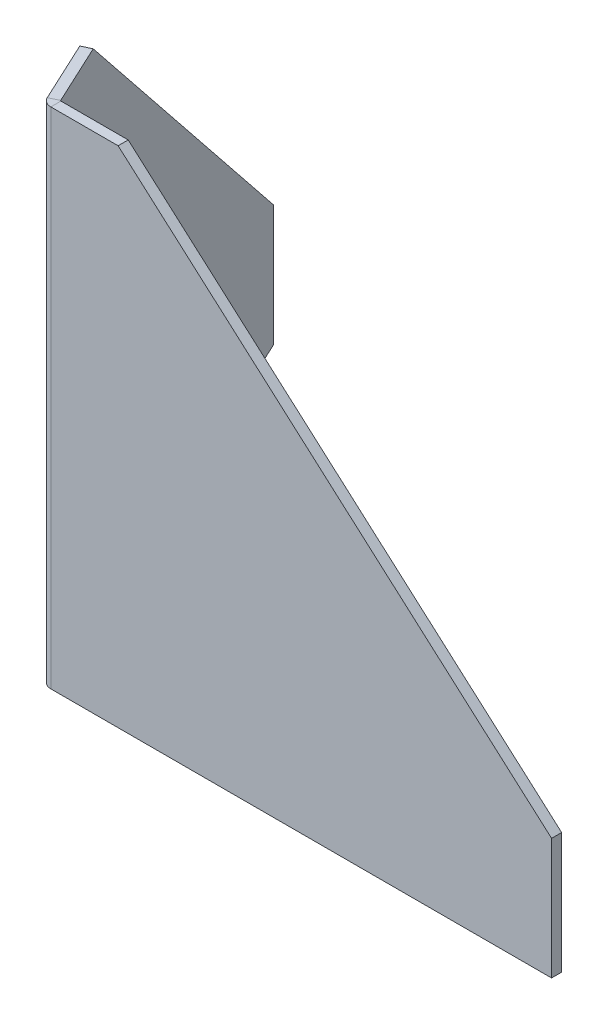
ISO-10303-21;
HEADER;
FILE_DESCRIPTION(('STEP AP214'),'2;1');
FILE_NAME('part.step','',(''),(''),'','','');
FILE_SCHEMA(('AUTOMOTIVE_DESIGN { 1 0 10303 214 1 1 1 1 }'));
ENDSEC;
DATA;
#1=APPLICATION_CONTEXT('core data for automotive mechanical design processes');
#2=APPLICATION_PROTOCOL_DEFINITION('international standard','automotive_design',2000,#1);
#3=PRODUCT_CONTEXT('',#1,'mechanical');
#4=PRODUCT('Part','Part','',(#3));
#5=PRODUCT_RELATED_PRODUCT_CATEGORY('part','',(#4));
#6=PRODUCT_DEFINITION_FORMATION('','',#4);
#7=PRODUCT_DEFINITION_CONTEXT('part definition',#1,'design');
#8=PRODUCT_DEFINITION('design','',#6,#7);
#9=PRODUCT_DEFINITION_SHAPE('','',#8);
#10=(LENGTH_UNIT() NAMED_UNIT(*) SI_UNIT(.MILLI.,.METRE.));
#11=(NAMED_UNIT(*) PLANE_ANGLE_UNIT() SI_UNIT($,.RADIAN.));
#12=(NAMED_UNIT(*) SI_UNIT($,.STERADIAN.) SOLID_ANGLE_UNIT());
#13=UNCERTAINTY_MEASURE_WITH_UNIT(LENGTH_MEASURE(1.E-05),#10,'distance_accuracy_value','');
#14=(GEOMETRIC_REPRESENTATION_CONTEXT(3) GLOBAL_UNCERTAINTY_ASSIGNED_CONTEXT((#13)) GLOBAL_UNIT_ASSIGNED_CONTEXT((#10,
#11,#12)) REPRESENTATION_CONTEXT('',''));
#15=CARTESIAN_POINT('',(0.,0.,0.));
#16=DIRECTION('',(0.,0.,1.));
#17=DIRECTION('',(1.,0.,0.));
#18=AXIS2_PLACEMENT_3D('',#15,#16,#17);
#19=CARTESIAN_POINT('',(-143481.126517868,128567.414220515,-7.47618913808878));
#20=DIRECTION('',(0.,1.,0.));
#21=DIRECTION('',(-0.906307787036651,0.,0.422618261740697));
#22=AXIS2_PLACEMENT_3D('',#19,#20,#21);
#23=PLANE('',#22);
#24=DIRECTION('',(-0.422618261740697,0.,-0.906307787036651));
#25=VECTOR('',#24,1.);
#26=CARTESIAN_POINT('',(-143490.189595738,128567.414220515,-3.25000652068752));
#27=LINE('',#26,#25);
#28=CARTESIAN_POINT('',(-143491.564788433,128567.414220515,-6.19911677096445));
#29=VERTEX_POINT('',#28);
#30=CARTESIAN_POINT('',(-143519.77287406,128567.414220515,-66.6915516132462));
#31=VERTEX_POINT('',#30);
#32=EDGE_CURVE('E150',#29,#31,#27,.T.);
#33=ORIENTED_EDGE('',*,*,#32,.F.);
#34=DIRECTION('',(0.906307787036651,0.,-0.422618261740697));
#35=VECTOR('',#34,1.);
#36=CARTESIAN_POINT('',(-143482.501710563,128567.414220515,-10.4252993884018));
#37=LINE('',#36,#35);
#38=CARTESIAN_POINT('',(-143482.501710563,128567.414220515,-10.4252993884011));
#39=VERTEX_POINT('',#38);
#40=EDGE_CURVE('E134',#29,#39,#37,.T.);
#41=ORIENTED_EDGE('',*,*,#40,.T.);
#42=DIRECTION('',(-0.422618261740697,0.,-0.906307787036651));
#43=VECTOR('',#42,1.);
#44=CARTESIAN_POINT('',(-143481.126517868,128567.414220515,-7.47618913808878));
#45=LINE('',#44,#43);
#46=CARTESIAN_POINT('',(-143510.70979619,128567.414220515,-70.9177342306475));
#47=VERTEX_POINT('',#46);
#48=EDGE_CURVE('E45',#39,#47,#45,.T.);
#49=ORIENTED_EDGE('',*,*,#48,.T.);
#50=DIRECTION('',(-0.906307787036651,0.,0.422618261740697));
#51=VECTOR('',#50,1.);
#52=CARTESIAN_POINT('',(-143510.70979619,128567.414220515,-70.9177342306475));
#53=LINE('',#52,#51);
#54=EDGE_CURVE('E159',#47,#31,#53,.T.);
#55=ORIENTED_EDGE('',*,*,#54,.T.);
#56=EDGE_LOOP('',(#33,#41,#49,#55));
#57=FACE_BOUND('',#56,.T.);
#58=ADVANCED_FACE('F41',(#57),#23,.T.);
#59=CARTESIAN_POINT('',(-143667.078553034,128067.414220515,-406.251615434201));
#60=DIRECTION('',(0.,-1.,0.));
#61=DIRECTION('',(0.906307787036651,0.,-0.422618261740697));
#62=AXIS2_PLACEMENT_3D('',#59,#60,#61);
#63=PLANE('',#62);
#64=DIRECTION('',(0.422618261740697,0.,0.906307787036651));
#65=VECTOR('',#64,1.);
#66=CARTESIAN_POINT('',(-143667.078553034,128067.414220515,-406.251615434201));
#67=LINE('',#66,#65);
#68=CARTESIAN_POINT('',(-143667.078553034,128067.414220515,-406.251615434201));
#69=VERTEX_POINT('',#68);
#70=CARTESIAN_POINT('',(-143482.501710563,128067.414220515,-10.4252993884018));
#71=VERTEX_POINT('',#70);
#72=EDGE_CURVE('E157',#69,#71,#67,.T.);
#73=ORIENTED_EDGE('',*,*,#72,.T.);
#74=DIRECTION('',(-0.906307787036651,0.,0.422618261740697));
#75=VECTOR('',#74,1.);
#76=CARTESIAN_POINT('',(-143482.501710563,128067.414220515,-10.4252993884018));
#77=LINE('',#76,#75);
#78=CARTESIAN_POINT('',(-143491.564788433,128067.414220515,-6.19911677096445));
#79=VERTEX_POINT('',#78);
#80=EDGE_CURVE('E12',#71,#79,#77,.T.);
#81=ORIENTED_EDGE('',*,*,#80,.T.);
#82=DIRECTION('',(0.422618261740697,0.,0.906307787036651));
#83=VECTOR('',#82,1.);
#84=CARTESIAN_POINT('',(-143676.141630904,128067.414220515,-402.025432816799));
#85=LINE('',#84,#83);
#86=CARTESIAN_POINT('',(-143676.141630904,128067.414220515,-402.025432816799));
#87=VERTEX_POINT('',#86);
#88=EDGE_CURVE('E161',#87,#79,#85,.T.);
#89=ORIENTED_EDGE('',*,*,#88,.F.);
#90=DIRECTION('',(-0.906307787036651,0.,0.422618261740697));
#91=VECTOR('',#90,1.);
#92=CARTESIAN_POINT('',(-143667.078553034,128067.414220515,-406.251615434201));
#93=LINE('',#92,#91);
#94=EDGE_CURVE('E67',#69,#87,#93,.T.);
#95=ORIENTED_EDGE('',*,*,#94,.F.);
#96=EDGE_LOOP('',(#73,#81,#89,#95));
#97=FACE_BOUND('',#96,.T.);
#98=ADVANCED_FACE('F43',(#97),#63,.T.);
#99=CARTESIAN_POINT('',(-82841.7079962175,0.,130034.176486218));
#100=DIRECTION('',(0.906307787036651,0.,-0.422618261740697));
#101=DIRECTION('',(-0.422618261740697,0.,-0.906307787036651));
#102=AXIS2_PLACEMENT_3D('',#99,#100,#101);
#103=PLANE('',#102);
#104=ORIENTED_EDGE('',*,*,#48,.F.);
#105=DIRECTION('',(0.,-1.,0.));
#106=VECTOR('',#105,1.);
#107=CARTESIAN_POINT('',(-143482.501710563,0.,-10.4252993884018));
#108=LINE('',#107,#106);
#109=EDGE_CURVE('E129',#39,#71,#108,.T.);
#110=ORIENTED_EDGE('',*,*,#109,.T.);
#111=ORIENTED_EDGE('',*,*,#72,.F.);
#112=DIRECTION('',(0.,-1.,0.));
#113=VECTOR('',#112,1.);
#114=CARTESIAN_POINT('',(-143667.078553034,128067.414220515,-406.251615434201));
#115=LINE('',#114,#113);
#116=CARTESIAN_POINT('',(-143667.078553034,128187.414220515,-406.251615434201));
#117=VERTEX_POINT('',#116);
#118=EDGE_CURVE('E160',#117,#69,#115,.T.);
#119=ORIENTED_EDGE('',*,*,#118,.F.);
#120=DIRECTION('',(-0.294825549996127,-0.716471188104806,-0.632255432309734));
#121=VECTOR('',#120,1.);
#122=CARTESIAN_POINT('',(-143667.078553034,128187.414220515,-406.251615434201));
#123=LINE('',#122,#121);
#124=EDGE_CURVE('E149',#47,#117,#123,.T.);
#125=ORIENTED_EDGE('',*,*,#124,.F.);
#126=EDGE_LOOP('',(#104,#110,#111,#119,#125));
#127=FACE_BOUND('',#126,.T.);
#128=ADVANCED_FACE('F146',(#127),#103,.T.);
#129=CARTESIAN_POINT('',(-143667.078553034,128067.414220515,-406.251615434201));
#130=DIRECTION('',(-0.422618261740697,0.,-0.906307787036651));
#131=DIRECTION('',(-0.906307787036651,0.,0.422618261740697));
#132=AXIS2_PLACEMENT_3D('',#129,#130,#131);
#133=PLANE('',#132);
#134=DIRECTION('',(0.,-1.,0.));
#135=VECTOR('',#134,1.);
#136=CARTESIAN_POINT('',(-143676.141630904,128067.414220515,-402.025432816799));
#137=LINE('',#136,#135);
#138=CARTESIAN_POINT('',(-143676.141630904,128187.414220515,-402.025432816799));
#139=VERTEX_POINT('',#138);
#140=EDGE_CURVE('E163',#139,#87,#137,.T.);
#141=ORIENTED_EDGE('',*,*,#140,.F.);
#142=DIRECTION('',(-0.906307787036651,0.,0.422618261740697));
#143=VECTOR('',#142,1.);
#144=CARTESIAN_POINT('',(-143667.078553034,128187.414220515,-406.251615434201));
#145=LINE('',#144,#143);
#146=EDGE_CURVE('E171',#117,#139,#145,.T.);
#147=ORIENTED_EDGE('',*,*,#146,.F.);
#148=ORIENTED_EDGE('',*,*,#118,.T.);
#149=ORIENTED_EDGE('',*,*,#94,.T.);
#150=EDGE_LOOP('',(#141,#147,#148,#149));
#151=FACE_BOUND('',#150,.T.);
#152=ADVANCED_FACE('F266',(#151),#133,.T.);
#153=CARTESIAN_POINT('',(-143667.078553034,128187.414220515,-406.251615434201));
#154=DIRECTION('',(-0.302793808104145,0.697616683154644,-0.649343416966787));
#155=DIRECTION('',(-0.294825549996127,-0.716471188104806,-0.632255432309734));
#156=AXIS2_PLACEMENT_3D('',#153,#154,#155);
#157=PLANE('',#156);
#158=DIRECTION('',(-0.294825549996127,-0.716471188104806,-0.632255432309734));
#159=VECTOR('',#158,1.);
#160=CARTESIAN_POINT('',(-143676.141630904,128187.414220515,-402.025432816799));
#161=LINE('',#160,#159);
#162=EDGE_CURVE('E169',#31,#139,#161,.T.);
#163=ORIENTED_EDGE('',*,*,#162,.F.);
#164=ORIENTED_EDGE('',*,*,#54,.F.);
#165=ORIENTED_EDGE('',*,*,#124,.T.);
#166=ORIENTED_EDGE('',*,*,#146,.T.);
#167=EDGE_LOOP('',(#163,#164,#165,#166));
#168=FACE_BOUND('',#167,.T.);
#169=ADVANCED_FACE('F172',(#168),#157,.T.);
#170=CARTESIAN_POINT('',(-82850.7710740878,0.,130038.402668835));
#171=DIRECTION('',(0.906307787036651,0.,-0.422618261740697));
#172=DIRECTION('',(-0.422618261740697,0.,-0.906307787036651));
#173=AXIS2_PLACEMENT_3D('',#170,#171,#172);
#174=PLANE('',#173);
#175=DIRECTION('',(0.,-1.,0.));
#176=VECTOR('',#175,1.);
#177=CARTESIAN_POINT('',(-143491.564788433,0.,-6.19911677100049));
#178=LINE('',#177,#176);
#179=EDGE_CURVE('E50',#29,#79,#178,.T.);
#180=ORIENTED_EDGE('',*,*,#179,.F.);
#181=ORIENTED_EDGE('',*,*,#32,.T.);
#182=ORIENTED_EDGE('',*,*,#162,.T.);
#183=ORIENTED_EDGE('',*,*,#140,.T.);
#184=ORIENTED_EDGE('',*,*,#88,.T.);
#185=EDGE_LOOP('',(#180,#181,#182,#183,#184));
#186=FACE_BOUND('',#185,.T.);
#187=ADVANCED_FACE('F166',(#186),#174,.F.);
#188=CARTESIAN_POINT('',(-142985.088107377,128067.414220515,-10.));
#189=DIRECTION('',(1.,0.,0.));
#190=DIRECTION('',(0.,0.,-1.));
#191=AXIS2_PLACEMENT_3D('',#188,#189,#190);
#192=PLANE('',#191);
#193=DIRECTION('',(0.,1.,0.));
#194=VECTOR('',#193,1.);
#195=CARTESIAN_POINT('',(-142985.088107377,128067.414220515,0.));
#196=LINE('',#195,#194);
#197=CARTESIAN_POINT('',(-142985.088107377,128067.414220515,0.));
#198=VERTEX_POINT('',#197);
#199=CARTESIAN_POINT('',(-142985.088107377,128187.414220515,0.));
#200=VERTEX_POINT('',#199);
#201=EDGE_CURVE('E209',#198,#200,#196,.T.);
#202=ORIENTED_EDGE('',*,*,#201,.F.);
#203=DIRECTION('',(0.,0.,1.));
#204=VECTOR('',#203,1.);
#205=CARTESIAN_POINT('',(-142985.088107377,128067.414220515,-10.));
#206=LINE('',#205,#204);
#207=CARTESIAN_POINT('',(-142985.088107377,128067.414220515,-10.));
#208=VERTEX_POINT('',#207);
#209=EDGE_CURVE('E173',#208,#198,#206,.T.);
#210=ORIENTED_EDGE('',*,*,#209,.F.);
#211=DIRECTION('',(0.,1.,0.));
#212=VECTOR('',#211,1.);
#213=CARTESIAN_POINT('',(-142985.088107377,128067.414220515,-10.));
#214=LINE('',#213,#212);
#215=CARTESIAN_POINT('',(-142985.088107377,128187.414220515,-10.));
#216=VERTEX_POINT('',#215);
#217=EDGE_CURVE('E190',#208,#216,#214,.T.);
#218=ORIENTED_EDGE('',*,*,#217,.T.);
#219=DIRECTION('',(0.,0.,1.));
#220=VECTOR('',#219,1.);
#221=CARTESIAN_POINT('',(-142985.088107377,128187.414220515,-10.));
#222=LINE('',#221,#220);
#223=EDGE_CURVE('E193',#216,#200,#222,.T.);
#224=ORIENTED_EDGE('',*,*,#223,.T.);
#225=EDGE_LOOP('',(#202,#210,#218,#224));
#226=FACE_BOUND('',#225,.T.);
#227=ADVANCED_FACE('F241',(#226),#192,.T.);
#228=CARTESIAN_POINT('',(-142985.088107377,128187.414220515,-10.));
#229=DIRECTION('',(0.662197796471728,0.749329085481131,0.));
#230=DIRECTION('',(-0.749329085481131,0.662197796471728,0.));
#231=AXIS2_PLACEMENT_3D('',#228,#229,#230);
#232=PLANE('',#231);
#233=DIRECTION('',(-0.749329085481131,0.662197796471728,0.));
#234=VECTOR('',#233,1.);
#235=CARTESIAN_POINT('',(-142985.088107377,128187.414220515,0.));
#236=LINE('',#235,#234);
#237=CARTESIAN_POINT('',(-143415.088107377,128567.414220515,0.));
#238=VERTEX_POINT('',#237);
#239=EDGE_CURVE('E212',#200,#238,#236,.T.);
#240=ORIENTED_EDGE('',*,*,#239,.F.);
#241=ORIENTED_EDGE('',*,*,#223,.F.);
#242=DIRECTION('',(-0.749329085481131,0.662197796471728,0.));
#243=VECTOR('',#242,1.);
#244=CARTESIAN_POINT('',(-142985.088107377,128187.414220515,-10.));
#245=LINE('',#244,#243);
#246=CARTESIAN_POINT('',(-143415.088107377,128567.414220515,-10.));
#247=VERTEX_POINT('',#246);
#248=EDGE_CURVE('E195',#216,#247,#245,.T.);
#249=ORIENTED_EDGE('',*,*,#248,.T.);
#250=DIRECTION('',(0.,0.,1.));
#251=VECTOR('',#250,1.);
#252=CARTESIAN_POINT('',(-143415.088107377,128567.414220515,-10.));
#253=LINE('',#252,#251);
#254=EDGE_CURVE('E198',#247,#238,#253,.T.);
#255=ORIENTED_EDGE('',*,*,#254,.T.);
#256=EDGE_LOOP('',(#240,#241,#249,#255));
#257=FACE_BOUND('',#256,.T.);
#258=ADVANCED_FACE('F246',(#257),#232,.T.);
#259=CARTESIAN_POINT('',(0.,0.,-10.));
#260=DIRECTION('',(0.,0.,-1.));
#261=DIRECTION('',(-1.,0.,0.));
#262=AXIS2_PLACEMENT_3D('',#259,#260,#261);
#263=PLANE('',#262);
#264=DIRECTION('',(0.,-1.,0.));
#265=VECTOR('',#264,1.);
#266=CARTESIAN_POINT('',(-143481.834124247,0.,-10.));
#267=LINE('',#266,#265);
#268=CARTESIAN_POINT('',(-143481.834124247,128567.414220515,-10.0000000000016));
#269=VERTEX_POINT('',#268);
#270=CARTESIAN_POINT('',(-143481.834124247,128067.414220515,-10.));
#271=VERTEX_POINT('',#270);
#272=EDGE_CURVE('E184',#269,#271,#267,.T.);
#273=ORIENTED_EDGE('',*,*,#272,.F.);
#274=DIRECTION('',(-1.,0.,0.));
#275=VECTOR('',#274,1.);
#276=CARTESIAN_POINT('',(-143485.088107377,128567.414220515,-10.));
#277=LINE('',#276,#275);
#278=EDGE_CURVE('E200',#247,#269,#277,.T.);
#279=ORIENTED_EDGE('',*,*,#278,.F.);
#280=ORIENTED_EDGE('',*,*,#248,.F.);
#281=ORIENTED_EDGE('',*,*,#217,.F.);
#282=DIRECTION('',(1.,0.,0.));
#283=VECTOR('',#282,1.);
#284=CARTESIAN_POINT('',(-143925.088107377,128067.414220515,-10.));
#285=LINE('',#284,#283);
#286=EDGE_CURVE('E177',#271,#208,#285,.T.);
#287=ORIENTED_EDGE('',*,*,#286,.F.);
#288=EDGE_LOOP('',(#273,#279,#280,#281,#287));
#289=FACE_BOUND('',#288,.T.);
#290=ADVANCED_FACE('F235',(#289),#263,.T.);
#291=CARTESIAN_POINT('',(-143485.088107377,128567.414220515,-10.));
#292=DIRECTION('',(0.,1.,0.));
#293=DIRECTION('',(0.,0.,1.));
#294=AXIS2_PLACEMENT_3D('',#291,#292,#293);
#295=PLANE('',#294);
#296=DIRECTION('',(0.,0.,-1.));
#297=VECTOR('',#296,1.);
#298=CARTESIAN_POINT('',(-143481.834124247,128567.414220515,-10.));
#299=LINE('',#298,#297);
#300=CARTESIAN_POINT('',(-143481.834124247,128567.414220515,0.));
#301=VERTEX_POINT('',#300);
#302=EDGE_CURVE('E142',#301,#269,#299,.T.);
#303=ORIENTED_EDGE('',*,*,#302,.F.);
#304=DIRECTION('',(-1.,0.,0.));
#305=VECTOR('',#304,1.);
#306=CARTESIAN_POINT('',(-143485.088107377,128567.414220515,0.));
#307=LINE('',#306,#305);
#308=EDGE_CURVE('E202',#238,#301,#307,.T.);
#309=ORIENTED_EDGE('',*,*,#308,.F.);
#310=ORIENTED_EDGE('',*,*,#254,.F.);
#311=ORIENTED_EDGE('',*,*,#278,.T.);
#312=EDGE_LOOP('',(#303,#309,#310,#311));
#313=FACE_BOUND('',#312,.T.);
#314=ADVANCED_FACE('F245',(#313),#295,.T.);
#315=CARTESIAN_POINT('',(0.,0.,0.));
#316=DIRECTION('',(0.,0.,-1.));
#317=DIRECTION('',(-1.,0.,0.));
#318=AXIS2_PLACEMENT_3D('',#315,#316,#317);
#319=PLANE('',#318);
#320=ORIENTED_EDGE('',*,*,#308,.T.);
#321=DIRECTION('',(0.,-1.,0.));
#322=VECTOR('',#321,1.);
#323=CARTESIAN_POINT('',(-143481.834124247,0.,0.));
#324=LINE('',#323,#322);
#325=CARTESIAN_POINT('',(-143481.834124247,128067.414220515,0.));
#326=VERTEX_POINT('',#325);
#327=EDGE_CURVE('E204',#301,#326,#324,.T.);
#328=ORIENTED_EDGE('',*,*,#327,.T.);
#329=DIRECTION('',(1.,0.,0.));
#330=VECTOR('',#329,1.);
#331=CARTESIAN_POINT('',(-143925.088107377,128067.414220515,0.));
#332=LINE('',#331,#330);
#333=EDGE_CURVE('E207',#326,#198,#332,.T.);
#334=ORIENTED_EDGE('',*,*,#333,.T.);
#335=ORIENTED_EDGE('',*,*,#201,.T.);
#336=ORIENTED_EDGE('',*,*,#239,.T.);
#337=EDGE_LOOP('',(#320,#328,#334,#335,#336));
#338=FACE_BOUND('',#337,.T.);
#339=ADVANCED_FACE('F225',(#338),#319,.F.);
#340=CARTESIAN_POINT('',(-143925.088107377,128067.414220515,-10.));
#341=DIRECTION('',(0.,-1.,0.));
#342=DIRECTION('',(0.,0.,-1.));
#343=AXIS2_PLACEMENT_3D('',#340,#341,#342);
#344=PLANE('',#343);
#345=DIRECTION('',(0.,0.,1.));
#346=VECTOR('',#345,1.);
#347=CARTESIAN_POINT('',(-143481.834124247,128067.414220515,-10.));
#348=LINE('',#347,#346);
#349=EDGE_CURVE('E186',#271,#326,#348,.T.);
#350=ORIENTED_EDGE('',*,*,#349,.F.);
#351=ORIENTED_EDGE('',*,*,#286,.T.);
#352=ORIENTED_EDGE('',*,*,#209,.T.);
#353=ORIENTED_EDGE('',*,*,#333,.F.);
#354=EDGE_LOOP('',(#350,#351,#352,#353));
#355=FACE_BOUND('',#354,.T.);
#356=ADVANCED_FACE('F231',(#355),#344,.T.);
#357=CARTESIAN_POINT('',(-143481.834124247,128567.414220515,-10.7366));
#358=DIRECTION('',(0.,-1.,0.));
#359=DIRECTION('',(0.,0.,-1.));
#360=AXIS2_PLACEMENT_3D('',#357,#358,#359);
#361=PLANE('',#360);
#362=ORIENTED_EDGE('',*,*,#40,.F.);
#363=CARTESIAN_POINT('',(-143481.834124247,128567.414220515,-10.7366));
#364=DIRECTION('',(0.,1.,0.));
#365=DIRECTION('',(0.,0.,1.));
#366=AXIS2_PLACEMENT_3D('',#363,#364,#365);
#367=CIRCLE('',#366,10.7366);
#368=EDGE_CURVE('E218',#29,#301,#367,.T.);
#369=ORIENTED_EDGE('',*,*,#368,.T.);
#370=ORIENTED_EDGE('',*,*,#302,.T.);
#371=CARTESIAN_POINT('',(-143481.834124247,128567.414220515,-10.7366));
#372=DIRECTION('',(0.,1.,0.));
#373=DIRECTION('',(0.,0.,-1.));
#374=AXIS2_PLACEMENT_3D('',#371,#372,#373);
#375=CIRCLE('',#374,0.736599999998407);
#376=EDGE_CURVE('E132',#39,#269,#375,.T.);
#377=ORIENTED_EDGE('',*,*,#376,.F.);
#378=EDGE_LOOP('',(#362,#369,#370,#377));
#379=FACE_BOUND('',#378,.T.);
#380=ADVANCED_FACE('F138',(#379),#361,.F.);
#381=CARTESIAN_POINT('',(-143481.834124247,128067.414220515,-10.7366));
#382=DIRECTION('',(0.,1.,0.));
#383=DIRECTION('',(0.,0.,1.));
#384=AXIS2_PLACEMENT_3D('',#381,#382,#383);
#385=PLANE('',#384);
#386=CARTESIAN_POINT('',(-143481.834124247,128067.414220515,-10.7366));
#387=DIRECTION('',(0.,1.,0.));
#388=DIRECTION('',(0.,0.,1.));
#389=AXIS2_PLACEMENT_3D('',#386,#387,#388);
#390=CIRCLE('',#389,10.7366);
#391=EDGE_CURVE('E143',#326,#79,#390,.F.);
#392=ORIENTED_EDGE('',*,*,#391,.T.);
#393=ORIENTED_EDGE('',*,*,#80,.F.);
#394=CARTESIAN_POINT('',(-143481.834124247,128067.414220515,-10.7366));
#395=DIRECTION('',(0.,-1.,0.));
#396=DIRECTION('',(0.,0.,1.));
#397=AXIS2_PLACEMENT_3D('',#394,#395,#396);
#398=CIRCLE('',#397,0.736599999998407);
#399=EDGE_CURVE('E58',#271,#71,#398,.T.);
#400=ORIENTED_EDGE('',*,*,#399,.F.);
#401=ORIENTED_EDGE('',*,*,#349,.T.);
#402=EDGE_LOOP('',(#392,#393,#400,#401));
#403=FACE_BOUND('',#402,.T.);
#404=ADVANCED_FACE('F229',(#403),#385,.F.);
#405=CARTESIAN_POINT('',(-143481.834124247,127817.271887149,-10.7366));
#406=DIRECTION('',(0.,1.,0.));
#407=DIRECTION('',(0.,0.,1.));
#408=AXIS2_PLACEMENT_3D('',#405,#406,#407);
#409=CYLINDRICAL_SURFACE('',#408,0.7366);
#410=ORIENTED_EDGE('',*,*,#272,.T.);
#411=ORIENTED_EDGE('',*,*,#399,.T.);
#412=ORIENTED_EDGE('',*,*,#109,.F.);
#413=ORIENTED_EDGE('',*,*,#376,.T.);
#414=EDGE_LOOP('',(#410,#411,#412,#413));
#415=FACE_BOUND('',#414,.T.);
#416=ADVANCED_FACE('F131',(#415),#409,.F.);
#417=CARTESIAN_POINT('',(-143481.834124247,127817.271887149,-10.7366));
#418=DIRECTION('',(0.,1.,0.));
#419=DIRECTION('',(0.,0.,1.));
#420=AXIS2_PLACEMENT_3D('',#417,#418,#419);
#421=CYLINDRICAL_SURFACE('',#420,10.7366);
#422=ORIENTED_EDGE('',*,*,#327,.F.);
#423=ORIENTED_EDGE('',*,*,#368,.F.);
#424=ORIENTED_EDGE('',*,*,#179,.T.);
#425=ORIENTED_EDGE('',*,*,#391,.F.);
#426=EDGE_LOOP('',(#422,#423,#424,#425));
#427=FACE_BOUND('',#426,.T.);
#428=ADVANCED_FACE('F222',(#427),#421,.T.);
#429=CLOSED_SHELL('',(#58,#98,#128,#152,#169,#187,#227,#258,#290,#314,#339,#356,#380,#404,#416,#428));
#430=MANIFOLD_SOLID_BREP('B2',#429);
#431=ADVANCED_BREP_SHAPE_REPRESENTATION('',(#18,#430),#14);
#432=SHAPE_DEFINITION_REPRESENTATION(#9,#431);
ENDSEC;
END-ISO-10303-21;
